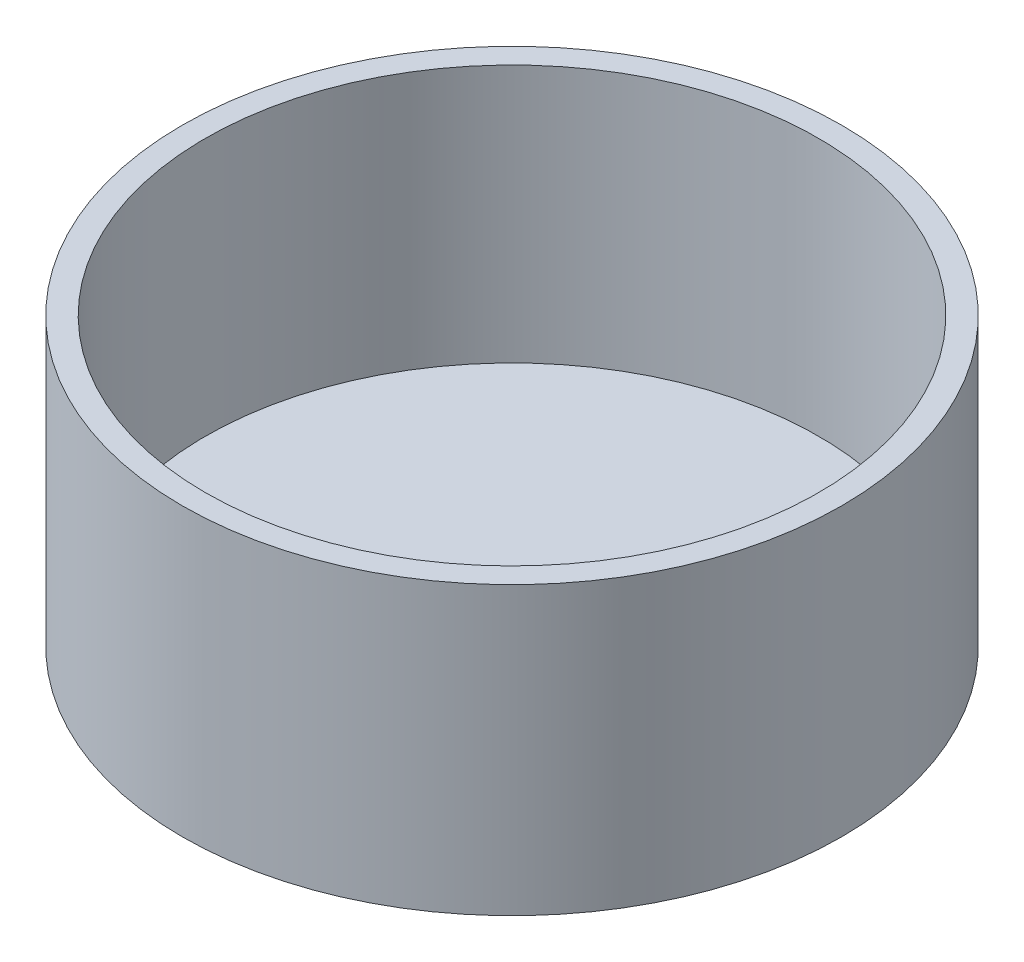
ISO-10303-21;
HEADER;
FILE_DESCRIPTION(('STEP AP214'),'2;1');
FILE_NAME('part.step','',(''),(''),'','','');
FILE_SCHEMA(('AUTOMOTIVE_DESIGN { 1 0 10303 214 1 1 1 1 }'));
ENDSEC;
DATA;
#1=APPLICATION_CONTEXT('core data for automotive mechanical design processes');
#2=APPLICATION_PROTOCOL_DEFINITION('international standard','automotive_design',2000,#1);
#3=PRODUCT_CONTEXT('',#1,'mechanical');
#4=PRODUCT('Part','Part','',(#3));
#5=PRODUCT_RELATED_PRODUCT_CATEGORY('part','',(#4));
#6=PRODUCT_DEFINITION_FORMATION('','',#4);
#7=PRODUCT_DEFINITION_CONTEXT('part definition',#1,'design');
#8=PRODUCT_DEFINITION('design','',#6,#7);
#9=PRODUCT_DEFINITION_SHAPE('','',#8);
#10=(LENGTH_UNIT() NAMED_UNIT(*) SI_UNIT(.MILLI.,.METRE.));
#11=(NAMED_UNIT(*) PLANE_ANGLE_UNIT() SI_UNIT($,.RADIAN.));
#12=(NAMED_UNIT(*) SI_UNIT($,.STERADIAN.) SOLID_ANGLE_UNIT());
#13=UNCERTAINTY_MEASURE_WITH_UNIT(LENGTH_MEASURE(1.E-05),#10,'distance_accuracy_value','');
#14=(GEOMETRIC_REPRESENTATION_CONTEXT(3) GLOBAL_UNCERTAINTY_ASSIGNED_CONTEXT((#13)) GLOBAL_UNIT_ASSIGNED_CONTEXT((#10,
#11,#12)) REPRESENTATION_CONTEXT('',''));
#15=CARTESIAN_POINT('',(0.,0.,0.));
#16=DIRECTION('',(0.,0.,1.));
#17=DIRECTION('',(1.,0.,0.));
#18=AXIS2_PLACEMENT_3D('',#15,#16,#17);
#19=CARTESIAN_POINT('',(0.,2.,0.));
#20=DIRECTION('',(0.,1.,0.));
#21=DIRECTION('',(0.,0.,1.));
#22=AXIS2_PLACEMENT_3D('',#19,#20,#21);
#23=PLANE('',#22);
#24=CARTESIAN_POINT('',(0.,2.,0.));
#25=DIRECTION('',(0.,1.,0.));
#26=DIRECTION('',(0.,0.,1.));
#27=AXIS2_PLACEMENT_3D('',#24,#25,#26);
#28=CIRCLE('',#27,21.4);
#29=CARTESIAN_POINT('',(0.,2.,21.4));
#30=VERTEX_POINT('',#29);
#31=EDGE_CURVE('E10',#30,#30,#28,.F.);
#32=ORIENTED_EDGE('',*,*,#31,.F.);
#33=EDGE_LOOP('',(#32));
#34=FACE_BOUND('',#33,.T.);
#35=ADVANCED_FACE('F30',(#34),#23,.T.);
#36=CARTESIAN_POINT('',(0.,20.,0.));
#37=DIRECTION('',(0.,1.,0.));
#38=DIRECTION('',(0.,0.,1.));
#39=AXIS2_PLACEMENT_3D('',#36,#37,#38);
#40=PLANE('',#39);
#41=CARTESIAN_POINT('',(0.,20.,0.));
#42=DIRECTION('',(0.,1.,0.));
#43=DIRECTION('',(0.,0.,1.));
#44=AXIS2_PLACEMENT_3D('',#41,#42,#43);
#45=CIRCLE('',#44,23.);
#46=CARTESIAN_POINT('',(0.,20.,23.));
#47=VERTEX_POINT('',#46);
#48=EDGE_CURVE('E37',#47,#47,#45,.T.);
#49=ORIENTED_EDGE('',*,*,#48,.T.);
#50=EDGE_LOOP('',(#49));
#51=FACE_BOUND('',#50,.T.);
#52=CARTESIAN_POINT('',(0.,20.,0.));
#53=DIRECTION('',(0.,1.,0.));
#54=DIRECTION('',(0.,0.,1.));
#55=AXIS2_PLACEMENT_3D('',#52,#53,#54);
#56=CIRCLE('',#55,21.4);
#57=CARTESIAN_POINT('',(0.,20.,21.4));
#58=VERTEX_POINT('',#57);
#59=EDGE_CURVE('E46',#58,#58,#56,.T.);
#60=ORIENTED_EDGE('',*,*,#59,.F.);
#61=EDGE_LOOP('',(#60));
#62=FACE_BOUND('',#61,.T.);
#63=ADVANCED_FACE('F53',(#51,#62),#40,.T.);
#64=CARTESIAN_POINT('',(0.,20.,0.));
#65=DIRECTION('',(0.,-1.,0.));
#66=DIRECTION('',(0.,0.,-1.));
#67=AXIS2_PLACEMENT_3D('',#64,#65,#66);
#68=CYLINDRICAL_SURFACE('',#67,23.);
#69=ORIENTED_EDGE('',*,*,#48,.F.);
#70=EDGE_LOOP('',(#69));
#71=FACE_BOUND('',#70,.T.);
#72=CARTESIAN_POINT('',(0.,0.,0.));
#73=DIRECTION('',(0.,1.,0.));
#74=DIRECTION('',(0.,0.,1.));
#75=AXIS2_PLACEMENT_3D('',#72,#73,#74);
#76=CIRCLE('',#75,23.);
#77=CARTESIAN_POINT('',(0.,0.,23.));
#78=VERTEX_POINT('',#77);
#79=EDGE_CURVE('E41',#78,#78,#76,.T.);
#80=ORIENTED_EDGE('',*,*,#79,.T.);
#81=EDGE_LOOP('',(#80));
#82=FACE_BOUND('',#81,.T.);
#83=ADVANCED_FACE('F55',(#71,#82),#68,.T.);
#84=CARTESIAN_POINT('',(0.,20.,0.));
#85=DIRECTION('',(0.,-1.,0.));
#86=DIRECTION('',(0.,0.,-1.));
#87=AXIS2_PLACEMENT_3D('',#84,#85,#86);
#88=CYLINDRICAL_SURFACE('',#87,21.4);
#89=ORIENTED_EDGE('',*,*,#31,.T.);
#90=EDGE_LOOP('',(#89));
#91=FACE_BOUND('',#90,.T.);
#92=ORIENTED_EDGE('',*,*,#59,.T.);
#93=EDGE_LOOP('',(#92));
#94=FACE_BOUND('',#93,.T.);
#95=ADVANCED_FACE('F51',(#91,#94),#88,.F.);
#96=CARTESIAN_POINT('',(0.,0.,0.));
#97=DIRECTION('',(0.,1.,0.));
#98=DIRECTION('',(0.,0.,1.));
#99=AXIS2_PLACEMENT_3D('',#96,#97,#98);
#100=PLANE('',#99);
#101=ORIENTED_EDGE('',*,*,#79,.F.);
#102=EDGE_LOOP('',(#101));
#103=FACE_BOUND('',#102,.T.);
#104=ADVANCED_FACE('F32',(#103),#100,.F.);
#105=CLOSED_SHELL('',(#35,#63,#83,#95,#104));
#106=MANIFOLD_SOLID_BREP('B2',#105);
#107=ADVANCED_BREP_SHAPE_REPRESENTATION('',(#18,#106),#14);
#108=SHAPE_DEFINITION_REPRESENTATION(#9,#107);
ENDSEC;
END-ISO-10303-21;
